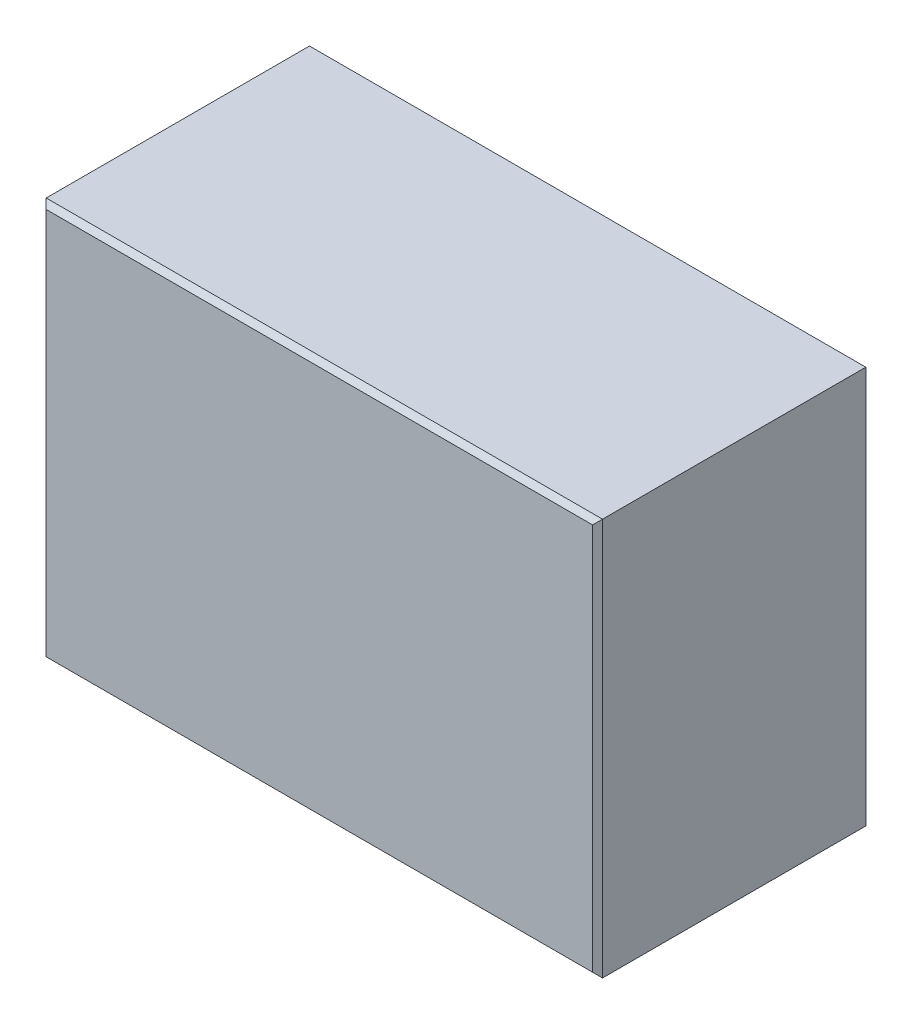
ISO-10303-21;
HEADER;
FILE_DESCRIPTION(('STEP AP214'),'2;1');
FILE_NAME('part.step','',(''),(''),'','','');
FILE_SCHEMA(('AUTOMOTIVE_DESIGN { 1 0 10303 214 1 1 1 1 }'));
ENDSEC;
DATA;
#1=APPLICATION_CONTEXT('core data for automotive mechanical design processes');
#2=APPLICATION_PROTOCOL_DEFINITION('international standard','automotive_design',2000,#1);
#3=PRODUCT_CONTEXT('',#1,'mechanical');
#4=PRODUCT('Part','Part','',(#3));
#5=PRODUCT_RELATED_PRODUCT_CATEGORY('part','',(#4));
#6=PRODUCT_DEFINITION_FORMATION('','',#4);
#7=PRODUCT_DEFINITION_CONTEXT('part definition',#1,'design');
#8=PRODUCT_DEFINITION('design','',#6,#7);
#9=PRODUCT_DEFINITION_SHAPE('','',#8);
#10=(LENGTH_UNIT() NAMED_UNIT(*) SI_UNIT(.MILLI.,.METRE.));
#11=(NAMED_UNIT(*) PLANE_ANGLE_UNIT() SI_UNIT($,.RADIAN.));
#12=(NAMED_UNIT(*) SI_UNIT($,.STERADIAN.) SOLID_ANGLE_UNIT());
#13=UNCERTAINTY_MEASURE_WITH_UNIT(LENGTH_MEASURE(1.E-05),#10,'distance_accuracy_value','');
#14=(GEOMETRIC_REPRESENTATION_CONTEXT(3) GLOBAL_UNCERTAINTY_ASSIGNED_CONTEXT((#13)) GLOBAL_UNIT_ASSIGNED_CONTEXT((#10,
#11,#12)) REPRESENTATION_CONTEXT('',''));
#15=CARTESIAN_POINT('',(0.,0.,0.));
#16=DIRECTION('',(0.,0.,1.));
#17=DIRECTION('',(1.,0.,0.));
#18=AXIS2_PLACEMENT_3D('',#15,#16,#17);
#19=CARTESIAN_POINT('',(-5.6,4.,5.5));
#20=DIRECTION('',(1.,0.,0.));
#21=DIRECTION('',(0.,1.,0.));
#22=AXIS2_PLACEMENT_3D('',#19,#20,#21);
#23=PLANE('',#22);
#24=DIRECTION('',(0.,0.,-1.));
#25=VECTOR('',#24,1.);
#26=CARTESIAN_POINT('',(-5.6,4.,5.5));
#27=LINE('',#26,#25);
#28=CARTESIAN_POINT('',(-5.6,4.,5.4));
#29=VERTEX_POINT('',#28);
#30=CARTESIAN_POINT('',(-5.6,4.,0.0999999999999994));
#31=VERTEX_POINT('',#30);
#32=EDGE_CURVE('E141',#29,#31,#27,.T.);
#33=ORIENTED_EDGE('',*,*,#32,.T.);
#34=DIRECTION('',(0.,-1.,0.));
#35=VECTOR('',#34,1.);
#36=CARTESIAN_POINT('',(-5.6,4.,0.0999999999999994));
#37=LINE('',#36,#35);
#38=CARTESIAN_POINT('',(-5.6,-4.,0.0999999999999994));
#39=VERTEX_POINT('',#38);
#40=EDGE_CURVE('E150',#31,#39,#37,.T.);
#41=ORIENTED_EDGE('',*,*,#40,.T.);
#42=DIRECTION('',(0.,0.,-1.));
#43=VECTOR('',#42,1.);
#44=CARTESIAN_POINT('',(-5.6,-4.,5.5));
#45=LINE('',#44,#43);
#46=CARTESIAN_POINT('',(-5.6,-4.,5.4));
#47=VERTEX_POINT('',#46);
#48=EDGE_CURVE('E119',#47,#39,#45,.T.);
#49=ORIENTED_EDGE('',*,*,#48,.F.);
#50=DIRECTION('',(0.,1.,0.));
#51=VECTOR('',#50,1.);
#52=CARTESIAN_POINT('',(-5.6,4.,5.4));
#53=LINE('',#52,#51);
#54=EDGE_CURVE('E152',#47,#29,#53,.T.);
#55=ORIENTED_EDGE('',*,*,#54,.T.);
#56=EDGE_LOOP('',(#33,#41,#49,#55));
#57=FACE_BOUND('',#56,.T.);
#58=ADVANCED_FACE('F32',(#57),#23,.F.);
#59=CARTESIAN_POINT('',(-5.6,-4.,5.5));
#60=DIRECTION('',(0.,1.,0.));
#61=DIRECTION('',(0.,0.,1.));
#62=AXIS2_PLACEMENT_3D('',#59,#60,#61);
#63=PLANE('',#62);
#64=ORIENTED_EDGE('',*,*,#48,.T.);
#65=DIRECTION('',(1.,0.,0.));
#66=VECTOR('',#65,1.);
#67=CARTESIAN_POINT('',(-5.6,-4.,0.0999999999999994));
#68=LINE('',#67,#66);
#69=CARTESIAN_POINT('',(5.6,-4.,0.0999999999999994));
#70=VERTEX_POINT('',#69);
#71=EDGE_CURVE('E118',#39,#70,#68,.T.);
#72=ORIENTED_EDGE('',*,*,#71,.T.);
#73=DIRECTION('',(0.,0.,-1.));
#74=VECTOR('',#73,1.);
#75=CARTESIAN_POINT('',(5.6,-4.,5.5));
#76=LINE('',#75,#74);
#77=CARTESIAN_POINT('',(5.6,-4.,5.4));
#78=VERTEX_POINT('',#77);
#79=EDGE_CURVE('E101',#78,#70,#76,.T.);
#80=ORIENTED_EDGE('',*,*,#79,.F.);
#81=DIRECTION('',(-1.,0.,0.));
#82=VECTOR('',#81,1.);
#83=CARTESIAN_POINT('',(-5.6,-4.,5.4));
#84=LINE('',#83,#82);
#85=EDGE_CURVE('E115',#78,#47,#84,.T.);
#86=ORIENTED_EDGE('',*,*,#85,.T.);
#87=EDGE_LOOP('',(#64,#72,#80,#86));
#88=FACE_BOUND('',#87,.T.);
#89=ADVANCED_FACE('F114',(#88),#63,.F.);
#90=CARTESIAN_POINT('',(5.6,4.,5.5));
#91=DIRECTION('',(-1.,0.,0.));
#92=DIRECTION('',(0.,-1.,0.));
#93=AXIS2_PLACEMENT_3D('',#90,#91,#92);
#94=PLANE('',#93);
#95=ORIENTED_EDGE('',*,*,#79,.T.);
#96=DIRECTION('',(0.,1.,0.));
#97=VECTOR('',#96,1.);
#98=CARTESIAN_POINT('',(5.6,4.,0.0999999999999994));
#99=LINE('',#98,#97);
#100=CARTESIAN_POINT('',(5.6,4.,0.0999999999999994));
#101=VERTEX_POINT('',#100);
#102=EDGE_CURVE('E107',#70,#101,#99,.T.);
#103=ORIENTED_EDGE('',*,*,#102,.T.);
#104=DIRECTION('',(0.,0.,-1.));
#105=VECTOR('',#104,1.);
#106=CARTESIAN_POINT('',(5.6,4.,5.5));
#107=LINE('',#106,#105);
#108=CARTESIAN_POINT('',(5.6,4.,5.4));
#109=VERTEX_POINT('',#108);
#110=EDGE_CURVE('E103',#109,#101,#107,.T.);
#111=ORIENTED_EDGE('',*,*,#110,.F.);
#112=DIRECTION('',(0.,-1.,0.));
#113=VECTOR('',#112,1.);
#114=CARTESIAN_POINT('',(5.6,-4.,5.4));
#115=LINE('',#114,#113);
#116=EDGE_CURVE('E98',#109,#78,#115,.T.);
#117=ORIENTED_EDGE('',*,*,#116,.T.);
#118=EDGE_LOOP('',(#95,#103,#111,#117));
#119=FACE_BOUND('',#118,.T.);
#120=ADVANCED_FACE('F100',(#119),#94,.F.);
#121=CARTESIAN_POINT('',(-5.6,4.,5.5));
#122=DIRECTION('',(0.,-1.,0.));
#123=DIRECTION('',(0.,0.,-1.));
#124=AXIS2_PLACEMENT_3D('',#121,#122,#123);
#125=PLANE('',#124);
#126=ORIENTED_EDGE('',*,*,#110,.T.);
#127=DIRECTION('',(-1.,0.,0.));
#128=VECTOR('',#127,1.);
#129=CARTESIAN_POINT('',(-5.6,4.,0.0999999999999994));
#130=LINE('',#129,#128);
#131=EDGE_CURVE('E154',#101,#31,#130,.T.);
#132=ORIENTED_EDGE('',*,*,#131,.T.);
#133=ORIENTED_EDGE('',*,*,#32,.F.);
#134=DIRECTION('',(1.,0.,0.));
#135=VECTOR('',#134,1.);
#136=CARTESIAN_POINT('',(5.6,4.,5.4));
#137=LINE('',#136,#135);
#138=EDGE_CURVE('E156',#29,#109,#137,.T.);
#139=ORIENTED_EDGE('',*,*,#138,.T.);
#140=EDGE_LOOP('',(#126,#132,#133,#139));
#141=FACE_BOUND('',#140,.T.);
#142=ADVANCED_FACE('F194',(#141),#125,.F.);
#143=CARTESIAN_POINT('',(0.,0.,5.5));
#144=DIRECTION('',(0.,0.,1.));
#145=DIRECTION('',(1.,0.,0.));
#146=AXIS2_PLACEMENT_3D('',#143,#144,#145);
#147=PLANE('',#146);
#148=DIRECTION('',(0.,1.,0.));
#149=VECTOR('',#148,1.);
#150=CARTESIAN_POINT('',(5.5,4.,5.5));
#151=LINE('',#150,#149);
#152=CARTESIAN_POINT('',(5.5,-3.9,5.5));
#153=VERTEX_POINT('',#152);
#154=CARTESIAN_POINT('',(5.5,3.9,5.5));
#155=VERTEX_POINT('',#154);
#156=EDGE_CURVE('E41',#153,#155,#151,.T.);
#157=ORIENTED_EDGE('',*,*,#156,.T.);
#158=DIRECTION('',(-1.,0.,0.));
#159=VECTOR('',#158,1.);
#160=CARTESIAN_POINT('',(-5.6,3.9,5.5));
#161=LINE('',#160,#159);
#162=CARTESIAN_POINT('',(-5.5,3.9,5.5));
#163=VERTEX_POINT('',#162);
#164=EDGE_CURVE('E11',#155,#163,#161,.T.);
#165=ORIENTED_EDGE('',*,*,#164,.T.);
#166=DIRECTION('',(0.,-1.,0.));
#167=VECTOR('',#166,1.);
#168=CARTESIAN_POINT('',(-5.5,-4.,5.5));
#169=LINE('',#168,#167);
#170=CARTESIAN_POINT('',(-5.5,-3.9,5.5));
#171=VERTEX_POINT('',#170);
#172=EDGE_CURVE('E148',#163,#171,#169,.T.);
#173=ORIENTED_EDGE('',*,*,#172,.T.);
#174=DIRECTION('',(1.,0.,0.));
#175=VECTOR('',#174,1.);
#176=CARTESIAN_POINT('',(5.6,-3.9,5.5));
#177=LINE('',#176,#175);
#178=EDGE_CURVE('E52',#171,#153,#177,.T.);
#179=ORIENTED_EDGE('',*,*,#178,.T.);
#180=EDGE_LOOP('',(#157,#165,#173,#179));
#181=FACE_BOUND('',#180,.T.);
#182=ADVANCED_FACE('F200',(#181),#147,.T.);
#183=CARTESIAN_POINT('',(0.,0.,0.));
#184=DIRECTION('',(0.,0.,1.));
#185=DIRECTION('',(1.,0.,0.));
#186=AXIS2_PLACEMENT_3D('',#183,#184,#185);
#187=PLANE('',#186);
#188=DIRECTION('',(0.,-1.,0.));
#189=VECTOR('',#188,1.);
#190=CARTESIAN_POINT('',(5.5,0.,0.));
#191=LINE('',#190,#189);
#192=CARTESIAN_POINT('',(5.5,3.9,0.));
#193=VERTEX_POINT('',#192);
#194=CARTESIAN_POINT('',(5.5,-3.9,0.));
#195=VERTEX_POINT('',#194);
#196=EDGE_CURVE('E161',#193,#195,#191,.T.);
#197=ORIENTED_EDGE('',*,*,#196,.T.);
#198=DIRECTION('',(-1.,0.,0.));
#199=VECTOR('',#198,1.);
#200=CARTESIAN_POINT('',(0.,-3.9,0.));
#201=LINE('',#200,#199);
#202=CARTESIAN_POINT('',(-5.5,-3.9,0.));
#203=VERTEX_POINT('',#202);
#204=EDGE_CURVE('E108',#195,#203,#201,.T.);
#205=ORIENTED_EDGE('',*,*,#204,.T.);
#206=DIRECTION('',(0.,1.,0.));
#207=VECTOR('',#206,1.);
#208=CARTESIAN_POINT('',(-5.5,0.,0.));
#209=LINE('',#208,#207);
#210=CARTESIAN_POINT('',(-5.5,3.9,0.));
#211=VERTEX_POINT('',#210);
#212=EDGE_CURVE('E165',#203,#211,#209,.T.);
#213=ORIENTED_EDGE('',*,*,#212,.T.);
#214=DIRECTION('',(1.,0.,0.));
#215=VECTOR('',#214,1.);
#216=CARTESIAN_POINT('',(0.,3.9,0.));
#217=LINE('',#216,#215);
#218=EDGE_CURVE('E163',#211,#193,#217,.T.);
#219=ORIENTED_EDGE('',*,*,#218,.T.);
#220=EDGE_LOOP('',(#197,#205,#213,#219));
#221=FACE_BOUND('',#220,.T.);
#222=ADVANCED_FACE('F202',(#221),#187,.F.);
#223=CARTESIAN_POINT('',(-5.6,4.,0.0999999999999994));
#224=DIRECTION('',(0.,-0.707106781186548,0.707106781186548));
#225=DIRECTION('',(-1.,0.,0.));
#226=AXIS2_PLACEMENT_3D('',#223,#224,#225);
#227=PLANE('',#226);
#228=DIRECTION('',(-0.577350269189626,-0.577350269189626,-0.577350269189626));
#229=VECTOR('',#228,1.);
#230=CARTESIAN_POINT('',(1.86666666666667,0.266666666666668,-3.63333333333333));
#231=LINE('',#230,#229);
#232=EDGE_CURVE('E142',#193,#101,#231,.F.);
#233=ORIENTED_EDGE('',*,*,#232,.F.);
#234=ORIENTED_EDGE('',*,*,#218,.F.);
#235=DIRECTION('',(0.577350269189628,-0.577350269189625,-0.577350269189625));
#236=VECTOR('',#235,1.);
#237=CARTESIAN_POINT('',(-5.6,4.,0.0999999999999994));
#238=LINE('',#237,#236);
#239=EDGE_CURVE('E138',#31,#211,#238,.T.);
#240=ORIENTED_EDGE('',*,*,#239,.F.);
#241=ORIENTED_EDGE('',*,*,#131,.F.);
#242=EDGE_LOOP('',(#233,#234,#240,#241));
#243=FACE_BOUND('',#242,.T.);
#244=ADVANCED_FACE('F181',(#243),#227,.F.);
#245=CARTESIAN_POINT('',(-5.6,4.,0.0999999999999994));
#246=DIRECTION('',(0.707106781186546,0.,0.707106781186549));
#247=DIRECTION('',(0.,-1.,0.));
#248=AXIS2_PLACEMENT_3D('',#245,#246,#247);
#249=PLANE('',#248);
#250=ORIENTED_EDGE('',*,*,#239,.T.);
#251=ORIENTED_EDGE('',*,*,#212,.F.);
#252=DIRECTION('',(-0.577350269189628,-0.577350269189625,0.577350269189625));
#253=VECTOR('',#252,1.);
#254=CARTESIAN_POINT('',(-2.93333333333333,-1.33333333333334,-2.56666666666666));
#255=LINE('',#254,#253);
#256=EDGE_CURVE('E129',#39,#203,#255,.F.);
#257=ORIENTED_EDGE('',*,*,#256,.F.);
#258=ORIENTED_EDGE('',*,*,#40,.F.);
#259=EDGE_LOOP('',(#250,#251,#257,#258));
#260=FACE_BOUND('',#259,.T.);
#261=ADVANCED_FACE('F185',(#260),#249,.F.);
#262=CARTESIAN_POINT('',(5.6,4.,0.0999999999999994));
#263=DIRECTION('',(-0.707106781186548,0.,0.707106781186548));
#264=DIRECTION('',(0.,1.,0.));
#265=AXIS2_PLACEMENT_3D('',#262,#263,#264);
#266=PLANE('',#265);
#267=ORIENTED_EDGE('',*,*,#232,.T.);
#268=ORIENTED_EDGE('',*,*,#102,.F.);
#269=DIRECTION('',(-0.577350269189626,0.577350269189626,-0.577350269189626));
#270=VECTOR('',#269,1.);
#271=CARTESIAN_POINT('',(2.93333333333333,-1.33333333333333,-2.56666666666667));
#272=LINE('',#271,#270);
#273=EDGE_CURVE('E128',#195,#70,#272,.F.);
#274=ORIENTED_EDGE('',*,*,#273,.F.);
#275=ORIENTED_EDGE('',*,*,#196,.F.);
#276=EDGE_LOOP('',(#267,#268,#274,#275));
#277=FACE_BOUND('',#276,.T.);
#278=ADVANCED_FACE('F193',(#277),#266,.F.);
#279=CARTESIAN_POINT('',(-5.6,-4.,0.0999999999999994));
#280=DIRECTION('',(0.,0.707106781186548,0.707106781186548));
#281=DIRECTION('',(1.,0.,0.));
#282=AXIS2_PLACEMENT_3D('',#279,#280,#281);
#283=PLANE('',#282);
#284=ORIENTED_EDGE('',*,*,#256,.T.);
#285=ORIENTED_EDGE('',*,*,#204,.F.);
#286=ORIENTED_EDGE('',*,*,#273,.T.);
#287=ORIENTED_EDGE('',*,*,#71,.F.);
#288=EDGE_LOOP('',(#284,#285,#286,#287));
#289=FACE_BOUND('',#288,.T.);
#290=ADVANCED_FACE('F188',(#289),#283,.F.);
#291=CARTESIAN_POINT('',(0.,-3.9,5.5));
#292=DIRECTION('',(0.,-0.707106781186548,0.707106781186548));
#293=DIRECTION('',(-1.,0.,0.));
#294=AXIS2_PLACEMENT_3D('',#291,#292,#293);
#295=PLANE('',#294);
#296=DIRECTION('',(0.577350269189628,0.577350269189625,0.577350269189625));
#297=VECTOR('',#296,1.);
#298=CARTESIAN_POINT('',(-4.2,-2.6,6.8));
#299=LINE('',#298,#297);
#300=EDGE_CURVE('E124',#47,#171,#299,.T.);
#301=ORIENTED_EDGE('',*,*,#300,.F.);
#302=ORIENTED_EDGE('',*,*,#85,.F.);
#303=DIRECTION('',(-0.577350269189626,0.577350269189626,0.577350269189626));
#304=VECTOR('',#303,1.);
#305=CARTESIAN_POINT('',(3.66666666666667,-2.06666666666667,7.33333333333333));
#306=LINE('',#305,#304);
#307=EDGE_CURVE('E36',#153,#78,#306,.F.);
#308=ORIENTED_EDGE('',*,*,#307,.F.);
#309=ORIENTED_EDGE('',*,*,#178,.F.);
#310=EDGE_LOOP('',(#301,#302,#308,#309));
#311=FACE_BOUND('',#310,.T.);
#312=ADVANCED_FACE('F34',(#311),#295,.T.);
#313=CARTESIAN_POINT('',(5.5,0.,5.5));
#314=DIRECTION('',(0.707106781186548,0.,0.707106781186548));
#315=DIRECTION('',(0.,-1.,0.));
#316=AXIS2_PLACEMENT_3D('',#313,#314,#315);
#317=PLANE('',#316);
#318=ORIENTED_EDGE('',*,*,#307,.T.);
#319=ORIENTED_EDGE('',*,*,#116,.F.);
#320=DIRECTION('',(-0.577350269189626,-0.577350269189626,0.577350269189626));
#321=VECTOR('',#320,1.);
#322=CARTESIAN_POINT('',(4.2,2.6,6.8));
#323=LINE('',#322,#321);
#324=EDGE_CURVE('E131',#155,#109,#323,.F.);
#325=ORIENTED_EDGE('',*,*,#324,.F.);
#326=ORIENTED_EDGE('',*,*,#156,.F.);
#327=EDGE_LOOP('',(#318,#319,#325,#326));
#328=FACE_BOUND('',#327,.T.);
#329=ADVANCED_FACE('F127',(#328),#317,.T.);
#330=CARTESIAN_POINT('',(-5.5,0.,5.5));
#331=DIRECTION('',(-0.707106781186546,0.,0.707106781186549));
#332=DIRECTION('',(0.,1.,0.));
#333=AXIS2_PLACEMENT_3D('',#330,#331,#332);
#334=PLANE('',#333);
#335=ORIENTED_EDGE('',*,*,#300,.T.);
#336=ORIENTED_EDGE('',*,*,#172,.F.);
#337=DIRECTION('',(-0.577350269189628,0.577350269189625,-0.577350269189625));
#338=VECTOR('',#337,1.);
#339=CARTESIAN_POINT('',(-4.2,2.6,6.8));
#340=LINE('',#339,#338);
#341=EDGE_CURVE('E134',#29,#163,#340,.F.);
#342=ORIENTED_EDGE('',*,*,#341,.F.);
#343=ORIENTED_EDGE('',*,*,#54,.F.);
#344=EDGE_LOOP('',(#335,#336,#342,#343));
#345=FACE_BOUND('',#344,.T.);
#346=ADVANCED_FACE('F199',(#345),#334,.T.);
#347=CARTESIAN_POINT('',(0.,3.9,5.5));
#348=DIRECTION('',(0.,0.707106781186548,0.707106781186548));
#349=DIRECTION('',(1.,0.,0.));
#350=AXIS2_PLACEMENT_3D('',#347,#348,#349);
#351=PLANE('',#350);
#352=ORIENTED_EDGE('',*,*,#324,.T.);
#353=ORIENTED_EDGE('',*,*,#138,.F.);
#354=ORIENTED_EDGE('',*,*,#341,.T.);
#355=ORIENTED_EDGE('',*,*,#164,.F.);
#356=EDGE_LOOP('',(#352,#353,#354,#355));
#357=FACE_BOUND('',#356,.T.);
#358=ADVANCED_FACE('F197',(#357),#351,.T.);
#359=CLOSED_SHELL('',(#58,#89,#120,#142,#182,#222,#244,#261,#278,#290,#312,#329,#346,#358));
#360=MANIFOLD_SOLID_BREP('B2',#359);
#361=ADVANCED_BREP_SHAPE_REPRESENTATION('',(#18,#360),#14);
#362=SHAPE_DEFINITION_REPRESENTATION(#9,#361);
ENDSEC;
END-ISO-10303-21;
